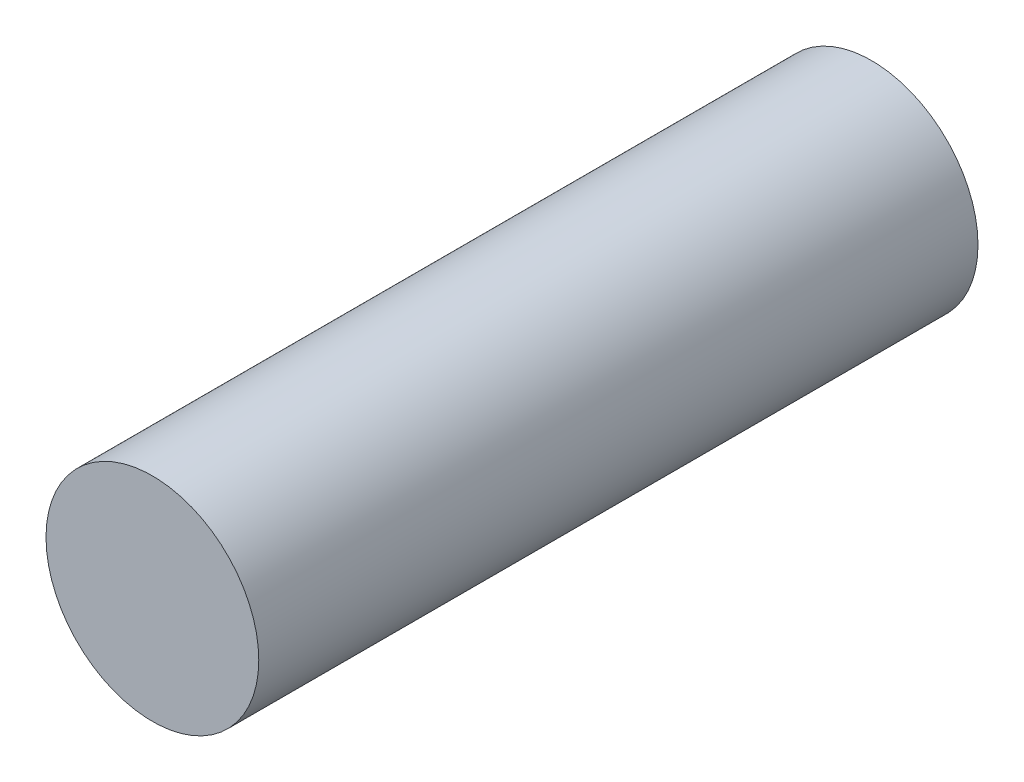
ISO-10303-21;
HEADER;
FILE_DESCRIPTION(('STEP AP214'),'2;1');
FILE_NAME('part.step','',(''),(''),'','','');
FILE_SCHEMA(('AUTOMOTIVE_DESIGN { 1 0 10303 214 1 1 1 1 }'));
ENDSEC;
DATA;
#1=APPLICATION_CONTEXT('core data for automotive mechanical design processes');
#2=APPLICATION_PROTOCOL_DEFINITION('international standard','automotive_design',2000,#1);
#3=PRODUCT_CONTEXT('',#1,'mechanical');
#4=PRODUCT('Part','Part','',(#3));
#5=PRODUCT_RELATED_PRODUCT_CATEGORY('part','',(#4));
#6=PRODUCT_DEFINITION_FORMATION('','',#4);
#7=PRODUCT_DEFINITION_CONTEXT('part definition',#1,'design');
#8=PRODUCT_DEFINITION('design','',#6,#7);
#9=PRODUCT_DEFINITION_SHAPE('','',#8);
#10=(LENGTH_UNIT() NAMED_UNIT(*) SI_UNIT(.MILLI.,.METRE.));
#11=(NAMED_UNIT(*) PLANE_ANGLE_UNIT() SI_UNIT($,.RADIAN.));
#12=(NAMED_UNIT(*) SI_UNIT($,.STERADIAN.) SOLID_ANGLE_UNIT());
#13=UNCERTAINTY_MEASURE_WITH_UNIT(LENGTH_MEASURE(1.E-05),#10,'distance_accuracy_value','');
#14=(GEOMETRIC_REPRESENTATION_CONTEXT(3) GLOBAL_UNCERTAINTY_ASSIGNED_CONTEXT((#13)) GLOBAL_UNIT_ASSIGNED_CONTEXT((#10,
#11,#12)) REPRESENTATION_CONTEXT('',''));
#15=CARTESIAN_POINT('',(0.,0.,0.));
#16=DIRECTION('',(0.,0.,1.));
#17=DIRECTION('',(1.,0.,0.));
#18=AXIS2_PLACEMENT_3D('',#15,#16,#17);
#19=CARTESIAN_POINT('',(0.,0.,48.));
#20=DIRECTION('',(0.,0.,-1.));
#21=DIRECTION('',(-1.,0.,0.));
#22=AXIS2_PLACEMENT_3D('',#19,#20,#21);
#23=CYLINDRICAL_SURFACE('',#22,7.1);
#24=CARTESIAN_POINT('',(0.,0.,48.));
#25=DIRECTION('',(0.,0.,1.));
#26=DIRECTION('',(1.,0.,0.));
#27=AXIS2_PLACEMENT_3D('',#24,#25,#26);
#28=CIRCLE('',#27,7.1);
#29=CARTESIAN_POINT('',(7.1,0.,48.));
#30=VERTEX_POINT('',#29);
#31=EDGE_CURVE('E37',#30,#30,#28,.T.);
#32=ORIENTED_EDGE('',*,*,#31,.F.);
#33=EDGE_LOOP('',(#32));
#34=FACE_BOUND('',#33,.T.);
#35=CARTESIAN_POINT('',(0.,0.,0.));
#36=DIRECTION('',(0.,0.,1.));
#37=DIRECTION('',(1.,0.,0.));
#38=AXIS2_PLACEMENT_3D('',#35,#36,#37);
#39=CIRCLE('',#38,7.1);
#40=CARTESIAN_POINT('',(7.1,0.,0.));
#41=VERTEX_POINT('',#40);
#42=EDGE_CURVE('E41',#41,#41,#39,.T.);
#43=ORIENTED_EDGE('',*,*,#42,.T.);
#44=EDGE_LOOP('',(#43));
#45=FACE_BOUND('',#44,.T.);
#46=ADVANCED_FACE('F31',(#34,#45),#23,.T.);
#47=CARTESIAN_POINT('',(0.,0.,48.));
#48=DIRECTION('',(0.,0.,1.));
#49=DIRECTION('',(1.,0.,0.));
#50=AXIS2_PLACEMENT_3D('',#47,#48,#49);
#51=PLANE('',#50);
#52=ORIENTED_EDGE('',*,*,#31,.T.);
#53=EDGE_LOOP('',(#52));
#54=FACE_BOUND('',#53,.T.);
#55=ADVANCED_FACE('F62',(#54),#51,.T.);
#56=CARTESIAN_POINT('',(0.,0.,0.));
#57=DIRECTION('',(0.,0.,1.));
#58=DIRECTION('',(1.,0.,0.));
#59=AXIS2_PLACEMENT_3D('',#56,#57,#58);
#60=PLANE('',#59);
#61=CARTESIAN_POINT('',(0.,0.,0.));
#62=DIRECTION('',(0.,0.,1.));
#63=DIRECTION('',(1.,0.,0.));
#64=AXIS2_PLACEMENT_3D('',#61,#62,#63);
#65=CIRCLE('',#64,2.5);
#66=CARTESIAN_POINT('',(2.5,0.,0.));
#67=VERTEX_POINT('',#66);
#68=EDGE_CURVE('E10',#67,#67,#65,.F.);
#69=ORIENTED_EDGE('',*,*,#68,.F.);
#70=EDGE_LOOP('',(#69));
#71=FACE_BOUND('',#70,.T.);
#72=ORIENTED_EDGE('',*,*,#42,.F.);
#73=EDGE_LOOP('',(#72));
#74=FACE_BOUND('',#73,.T.);
#75=ADVANCED_FACE('F55',(#71,#74),#60,.F.);
#76=CARTESIAN_POINT('',(0.,0.,-2.));
#77=DIRECTION('',(0.,0.,1.));
#78=DIRECTION('',(1.,0.,0.));
#79=AXIS2_PLACEMENT_3D('',#76,#77,#78);
#80=CYLINDRICAL_SURFACE('',#79,2.5);
#81=CARTESIAN_POINT('',(0.,0.,-2.));
#82=DIRECTION('',(0.,0.,-1.));
#83=DIRECTION('',(-1.,0.,0.));
#84=AXIS2_PLACEMENT_3D('',#81,#82,#83);
#85=CIRCLE('',#84,2.5);
#86=CARTESIAN_POINT('',(-2.5,0.,-2.));
#87=VERTEX_POINT('',#86);
#88=EDGE_CURVE('E46',#87,#87,#85,.T.);
#89=ORIENTED_EDGE('',*,*,#88,.F.);
#90=EDGE_LOOP('',(#89));
#91=FACE_BOUND('',#90,.T.);
#92=ORIENTED_EDGE('',*,*,#68,.T.);
#93=EDGE_LOOP('',(#92));
#94=FACE_BOUND('',#93,.T.);
#95=ADVANCED_FACE('F53',(#91,#94),#80,.T.);
#96=CARTESIAN_POINT('',(0.,0.,-2.));
#97=DIRECTION('',(0.,0.,-1.));
#98=DIRECTION('',(-1.,0.,0.));
#99=AXIS2_PLACEMENT_3D('',#96,#97,#98);
#100=PLANE('',#99);
#101=ORIENTED_EDGE('',*,*,#88,.T.);
#102=EDGE_LOOP('',(#101));
#103=FACE_BOUND('',#102,.T.);
#104=ADVANCED_FACE('F51',(#103),#100,.T.);
#105=CLOSED_SHELL('',(#46,#55,#75,#95,#104));
#106=MANIFOLD_SOLID_BREP('B2',#105);
#107=ADVANCED_BREP_SHAPE_REPRESENTATION('',(#18,#106),#14);
#108=SHAPE_DEFINITION_REPRESENTATION(#9,#107);
ENDSEC;
END-ISO-10303-21;
